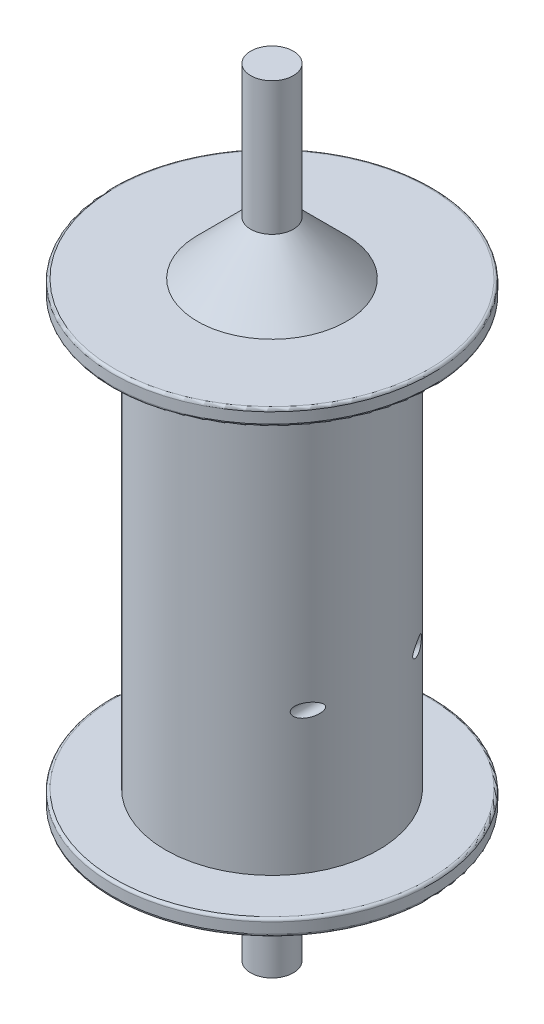
ISO-10303-21;
HEADER;
FILE_DESCRIPTION(('STEP AP214'),'2;1');
FILE_NAME('part.step','',(''),(''),'','','');
FILE_SCHEMA(('AUTOMOTIVE_DESIGN { 1 0 10303 214 1 1 1 1 }'));
ENDSEC;
DATA;
#1=APPLICATION_CONTEXT('core data for automotive mechanical design processes');
#2=APPLICATION_PROTOCOL_DEFINITION('international standard','automotive_design',2000,#1);
#3=PRODUCT_CONTEXT('',#1,'mechanical');
#4=PRODUCT('Part','Part','',(#3));
#5=PRODUCT_RELATED_PRODUCT_CATEGORY('part','',(#4));
#6=PRODUCT_DEFINITION_FORMATION('','',#4);
#7=PRODUCT_DEFINITION_CONTEXT('part definition',#1,'design');
#8=PRODUCT_DEFINITION('design','',#6,#7);
#9=PRODUCT_DEFINITION_SHAPE('','',#8);
#10=(LENGTH_UNIT() NAMED_UNIT(*) SI_UNIT(.MILLI.,.METRE.));
#11=(NAMED_UNIT(*) PLANE_ANGLE_UNIT() SI_UNIT($,.RADIAN.));
#12=(NAMED_UNIT(*) SI_UNIT($,.STERADIAN.) SOLID_ANGLE_UNIT());
#13=UNCERTAINTY_MEASURE_WITH_UNIT(LENGTH_MEASURE(1.E-05),#10,'distance_accuracy_value','');
#14=(GEOMETRIC_REPRESENTATION_CONTEXT(3) GLOBAL_UNCERTAINTY_ASSIGNED_CONTEXT((#13)) GLOBAL_UNIT_ASSIGNED_CONTEXT((#10,
#11,#12)) REPRESENTATION_CONTEXT('',''));
#15=CARTESIAN_POINT('',(0.,0.,0.));
#16=DIRECTION('',(0.,0.,1.));
#17=DIRECTION('',(1.,0.,0.));
#18=AXIS2_PLACEMENT_3D('',#15,#16,#17);
#19=CARTESIAN_POINT('',(0.,80.,0.));
#20=DIRECTION('',(0.,-1.,0.));
#21=DIRECTION('',(0.,0.,-1.));
#22=AXIS2_PLACEMENT_3D('',#19,#20,#21);
#23=CYLINDRICAL_SURFACE('',#22,20.);
#24=CARTESIAN_POINT('',(18.25,26.5,-8.18153408597678));
#25=CARTESIAN_POINT('',(18.2499979618495,26.5318652497159,-8.18153884534951));
#26=CARTESIAN_POINT('',(18.2487663345979,26.5637626117693,-8.18428763452343));
#27=CARTESIAN_POINT('',(18.2439821946172,26.6265129694464,-8.19494631892766));
#28=CARTESIAN_POINT('',(18.2404252330995,26.6573638436964,-8.20286610718577));
#29=CARTESIAN_POINT('',(18.2301689327124,26.7250311230748,-8.2256386310512));
#30=CARTESIAN_POINT('',(18.2228950490591,26.761328671932,-8.24175415086842));
#31=CARTESIAN_POINT('',(18.2060082732849,26.8306414942487,-8.27899046747495));
#32=CARTESIAN_POINT('',(18.1963903821279,26.8636495373818,-8.30012195922484));
#33=CARTESIAN_POINT('',(18.1682381813938,26.9481769531364,-8.3616327428717));
#34=CARTESIAN_POINT('',(18.1481258279905,26.9967837974186,-8.40524322231704));
#35=CARTESIAN_POINT('',(18.1048709718405,27.086731508888,-8.49801750474048));
#36=CARTESIAN_POINT('',(18.0817200906233,27.1280515165637,-8.54719660925664));
#37=CARTESIAN_POINT('',(18.0323065180823,27.2064500817202,-8.65097444042177));
#38=CARTESIAN_POINT('',(18.0059550599804,27.2432846558518,-8.70571281472922));
#39=CARTESIAN_POINT('',(17.9514818227984,27.311849051186,-8.81749273796982));
#40=CARTESIAN_POINT('',(17.9233582529772,27.3435735897036,-8.87453659505914));
#41=CARTESIAN_POINT('',(17.8656053143084,27.4027394853473,-8.99023563414717));
#42=CARTESIAN_POINT('',(17.8359727815016,27.4301713064965,-9.04889407248482));
#43=CARTESIAN_POINT('',(17.7754430835534,27.4811996440365,-9.16722681236843));
#44=CARTESIAN_POINT('',(17.7445455149505,27.5047949247112,-9.22690143440823));
#45=CARTESIAN_POINT('',(17.6564623886966,27.5659841469318,-9.3949016797859));
#46=CARTESIAN_POINT('',(17.5980046919071,27.5996926569812,-9.50398910329019));
#47=CARTESIAN_POINT('',(17.4778841662439,27.656955997879,-9.72312770751564));
#48=CARTESIAN_POINT('',(17.4162187918451,27.6805026224225,-9.83317959419977));
#49=CARTESIAN_POINT('',(17.2900944470269,27.7176469997297,-10.0532937324051));
#50=CARTESIAN_POINT('',(17.2256367929209,27.7312493874081,-10.1633559551539));
#51=CARTESIAN_POINT('',(17.0942906203097,27.7481953996157,-10.3827527365292));
#52=CARTESIAN_POINT('',(17.0274037188896,27.75154572646,-10.49208772391));
#53=CARTESIAN_POINT('',(16.9148238941733,27.7478949587043,-10.6722002204739));
#54=CARTESIAN_POINT('',(16.8696901242737,27.7440369647178,-10.7433995313137));
#55=CARTESIAN_POINT('',(16.7787484162455,27.7311205130553,-10.8848825037342));
#56=CARTESIAN_POINT('',(16.7329406414454,27.722063295701,-10.9551663796119));
#57=CARTESIAN_POINT('',(16.6409748576567,27.6982710209263,-11.0943634179851));
#58=CARTESIAN_POINT('',(16.5948176404067,27.6835463556494,-11.1632788479276));
#59=CARTESIAN_POINT('',(16.5024468260574,27.6477769933641,-11.2993809420132));
#60=CARTESIAN_POINT('',(16.4562332660875,27.6267352975636,-11.3665684106866));
#61=CARTESIAN_POINT('',(16.3537847265129,27.5719203043626,-11.5136205429476));
#62=CARTESIAN_POINT('',(16.2976547525129,27.5363416181116,-11.5929032189268));
#63=CARTESIAN_POINT('',(16.1875409778504,27.452469090144,-11.7461639963895));
#64=CARTESIAN_POINT('',(16.1335548817263,27.4041892945189,-11.8201478435371));
#65=CARTESIAN_POINT('',(16.0458100888785,27.3092310899585,-11.9388319043949));
#66=CARTESIAN_POINT('',(16.0108289717262,27.2663882303611,-11.9856747355146));
#67=CARTESIAN_POINT('',(15.9447173915627,27.1724339808456,-12.0734827039819));
#68=CARTESIAN_POINT('',(15.9135807359863,27.1213362025794,-12.1144573112112));
#69=CARTESIAN_POINT('',(15.8647445696281,27.0251510065859,-12.1783025494351));
#70=CARTESIAN_POINT('',(15.8456693582015,26.9820493263756,-12.2030949754339));
#71=CARTESIAN_POINT('',(15.8118732042328,26.8913882368862,-12.2468538774847));
#72=CARTESIAN_POINT('',(15.7971465724964,26.8438347601409,-12.2658279668584));
#73=CARTESIAN_POINT('',(15.7750311378532,26.7526030285834,-12.2942535091383));
#74=CARTESIAN_POINT('',(15.7668685552708,26.7094295324647,-12.3047122850693));
#75=CARTESIAN_POINT('',(15.7551255568537,26.6214584014552,-12.3197448098078));
#76=CARTESIAN_POINT('',(15.7515425070371,26.5766617154266,-12.3243219415329));
#77=CARTESIAN_POINT('',(15.7492592619295,26.4866487019658,-12.3272396300037));
#78=CARTESIAN_POINT('',(15.7505686938109,26.4414317219873,-12.325567890541));
#79=CARTESIAN_POINT('',(15.7579760619954,26.3520476548203,-12.3160961650278));
#80=CARTESIAN_POINT('',(15.7640755393859,26.3078809102333,-12.3082942067193));
#81=CARTESIAN_POINT('',(15.7803907811538,26.2226991021763,-12.2873689233822));
#82=CARTESIAN_POINT('',(15.7905148796342,26.1816365948824,-12.2743640615191));
#83=CARTESIAN_POINT('',(15.814221068499,26.1023256097946,-12.2438060506497));
#84=CARTESIAN_POINT('',(15.8278045029705,26.0640782332516,-12.2262511337222));
#85=CARTESIAN_POINT('',(15.8656838826613,25.9713272201487,-12.1770878179632));
#86=CARTESIAN_POINT('',(15.8918463926548,25.9189215891329,-12.142956664645));
#87=CARTESIAN_POINT('',(15.9486035008762,25.8215771563617,-12.0683165498785));
#88=CARTESIAN_POINT('',(15.9792096104827,25.7766584196726,-12.0277909989893));
#89=CARTESIAN_POINT('',(16.0605929323507,25.6714288143793,-11.9190636294709));
#90=CARTESIAN_POINT('',(16.1133386769171,25.6159022397819,-11.847732779761));
#91=CARTESIAN_POINT('',(16.222052111135,25.5188695717282,-11.6984453137725));
#92=CARTESIAN_POINT('',(16.2780254413307,25.4773889510443,-11.6204769771463));
#93=CARTESIAN_POINT('',(16.3817913420178,25.4121521582266,-11.4736050995131));
#94=CARTESIAN_POINT('',(16.4293973576002,25.3865959495468,-11.4053487899968));
#95=CARTESIAN_POINT('',(16.5248107730467,25.3426510104751,-11.2666640559575));
#96=CARTESIAN_POINT('',(16.5726182843945,25.3242669858039,-11.196234237966));
#97=CARTESIAN_POINT('',(16.6680585368355,25.2938370631572,-11.0536512567992));
#98=CARTESIAN_POINT('',(16.71569049416,25.2818078624627,-10.9814940692459));
#99=CARTESIAN_POINT('',(16.8103432993606,25.2635320725748,-10.836046078069));
#100=CARTESIAN_POINT('',(16.8573639654045,25.2572871668308,-10.7627549507318));
#101=CARTESIAN_POINT('',(16.9730176819289,25.2483710624827,-10.5798557519244));
#102=CARTESIAN_POINT('',(17.0411461216582,25.2488723222167,-10.4697669449177));
#103=CARTESIAN_POINT('',(17.1750362359315,25.2604921786806,-10.2486515491821));
#104=CARTESIAN_POINT('',(17.2407962643157,25.2716180176591,-10.1376243719829));
#105=CARTESIAN_POINT('',(17.3693347642527,25.3039768665793,-9.91577509869834));
#106=CARTESIAN_POINT('',(17.4321216139703,25.3251793552162,-9.80495339114142));
#107=CARTESIAN_POINT('',(17.5545319110459,25.377754078299,-9.5840660570318));
#108=CARTESIAN_POINT('',(17.6141579876834,25.4091177007132,-9.47399987052744));
#109=CARTESIAN_POINT('',(17.7124503527016,25.4717927065877,-9.28851883401322));
#110=CARTESIAN_POINT('',(17.7520305525731,25.5002873223724,-9.21263080203235));
#111=CARTESIAN_POINT('',(17.8292944910218,25.5633730533634,-9.06219636824689));
#112=CARTESIAN_POINT('',(17.8669748377823,25.5979746080458,-8.98765250865495));
#113=CARTESIAN_POINT('',(17.9246598456303,25.6583107239406,-8.87180022234154));
#114=CARTESIAN_POINT('',(17.9454554414222,25.6816859033931,-8.82965309800986));
#115=CARTESIAN_POINT('',(17.9861133324433,25.731165057513,-8.74653435697943));
#116=CARTESIAN_POINT('',(18.0059759661335,25.7572680313311,-8.70556231611631));
#117=CARTESIAN_POINT('',(18.0445251983253,25.8125414279372,-8.62537435256812));
#118=CARTESIAN_POINT('',(18.0632154514802,25.8417014747505,-8.58615309503916));
#119=CARTESIAN_POINT('',(18.099184385422,25.9036962173159,-8.51006982284513));
#120=CARTESIAN_POINT('',(18.1164647540978,25.9365264041724,-8.47320499890406));
#121=CARTESIAN_POINT('',(18.1460255840916,25.999898175494,-8.40968126030712));
#122=CARTESIAN_POINT('',(18.1586301207258,26.0296759991292,-8.38241909712536));
#123=CARTESIAN_POINT('',(18.18222598905,26.0926038385701,-8.33111366009879));
#124=CARTESIAN_POINT('',(18.1932151904269,26.1257582116088,-8.30707464055781));
#125=CARTESIAN_POINT('',(18.2131045786201,26.1962848840155,-8.26337740487946));
#126=CARTESIAN_POINT('',(18.221968351751,26.2337164103737,-8.24379580742511));
#127=CARTESIAN_POINT('',(18.2364214595161,26.312059220127,-8.21177505077274));
#128=CARTESIAN_POINT('',(18.2420279580057,26.3529509382651,-8.1992984595468));
#129=CARTESIAN_POINT('',(18.2470293131828,26.4121199779719,-8.18815804078524));
#130=CARTESIAN_POINT('',(18.2481385271482,26.4295784500674,-8.18568528219678));
#131=CARTESIAN_POINT('',(18.2496245533631,26.4646879532103,-8.18237172295775));
#132=CARTESIAN_POINT('',(18.250001129622,26.4823390444621,-8.18153144814808));
#133=CARTESIAN_POINT('',(18.25,26.5,-8.18153408597678));
#134=B_SPLINE_CURVE_WITH_KNOTS('',3,(#24,#25,#26,#27,#28,#29,#30,#31,#32,#33,#34,#35,#36,#37,
#38,#39,#40,#41,#42,#43,#44,#45,#46,#47,#48,#49,#50,#51,#52,#53,#54,#55,#56,#57,#58,#59,#60,#61,
#62,#63,#64,#65,#66,#67,#68,#69,#70,#71,#72,#73,#74,#75,#76,#77,#78,#79,#80,#81,#82,#83,#84,#85,
#86,#87,#88,#89,#90,#91,#92,#93,#94,#95,#96,#97,#98,#99,#100,#101,#102,#103,#104,#105,#106,#107,
#108,#109,#110,#111,#112,#113,#114,#115,#116,#117,#118,#119,#120,#121,#122,#123,#124,#125,#126,
#127,#128,#129,#130,#131,#132,#133),.UNSPECIFIED.,.T.,.F.,(4,2,2,2,2,2,2,2,2,2,2,2,2,2,2,2,2,2,
2,2,2,2,2,2,2,2,2,2,2,2,2,2,2,2,2,2,2,2,2,2,2,2,2,2,2,2,2,2,2,2,2,2,2,2,4),(0.,
0.0955188878894089,0.19122105775398,0.311656689349104,0.432351455411104,0.636192488468969,
0.840607891350387,1.05342106226923,1.2664528437971,1.479951341028,1.69351846861236,
2.07778977112906,2.46237081668899,2.84677249818878,3.230922822209,3.48394236641333,
3.73690157559069,3.9893991377883,4.24177692825649,4.5514105911752,4.86070326086815,
5.07753895246557,5.29402068307205,5.45323615260761,5.61224239007829,5.74715321293668,
5.8819864049894,6.01708505442484,6.15222718657008,6.28445307743014,6.41673042180654,
6.61895177951463,6.82170667231587,7.13393538059804,7.44672733010158,7.70753094081837,
7.96850538000418,8.23016216049214,8.49189506912547,8.8797584124484,9.26788633183452,
9.6548460655668,10.0414786872295,10.3119215721782,10.5828313229606,10.7402303123511,
10.8975717522274,11.0543954646152,11.2110285880269,11.3376958565531,11.4645287040275,
11.5934000314521,11.7215859778386,11.7745092006407,11.8274494677681),.UNSPECIFIED.);
#135=CARTESIAN_POINT('',(18.25,26.5,-8.18153408597678));
#136=VERTEX_POINT('',#135);
#137=EDGE_CURVE('E87',#136,#136,#134,.T.);
#138=ORIENTED_EDGE('',*,*,#137,.T.);
#139=EDGE_LOOP('',(#138));
#140=FACE_BOUND('',#139,.T.);
#141=CARTESIAN_POINT('',(18.25,26.5,8.18153408597678));
#142=CARTESIAN_POINT('',(18.2499979618495,26.4681347502841,8.18153884534951));
#143=CARTESIAN_POINT('',(18.2487663345979,26.4362373882307,8.18428763452343));
#144=CARTESIAN_POINT('',(18.2439821946172,26.3734870305536,8.19494631892766));
#145=CARTESIAN_POINT('',(18.2404252330995,26.3426361563036,8.20286610718577));
#146=CARTESIAN_POINT('',(18.2301689327124,26.2749688769252,8.2256386310512));
#147=CARTESIAN_POINT('',(18.2228950490591,26.2386713280679,8.24175415086842));
#148=CARTESIAN_POINT('',(18.2060082732849,26.1693585057513,8.27899046747496));
#149=CARTESIAN_POINT('',(18.1963903821279,26.1363504626182,8.30012195922484));
#150=CARTESIAN_POINT('',(18.1682381813938,26.0518230468636,8.3616327428717));
#151=CARTESIAN_POINT('',(18.1481258279905,26.0032162025813,8.40524322231704));
#152=CARTESIAN_POINT('',(18.1048709718405,25.913268491112,8.49801750474048));
#153=CARTESIAN_POINT('',(18.0817200906233,25.8719484834363,8.54719660925664));
#154=CARTESIAN_POINT('',(18.0323065180823,25.7935499182798,8.65097444042177));
#155=CARTESIAN_POINT('',(18.0059550599804,25.7567153441482,8.70571281472922));
#156=CARTESIAN_POINT('',(17.9514818227984,25.688150948814,8.81749273796982));
#157=CARTESIAN_POINT('',(17.9233582529772,25.6564264102964,8.87453659505914));
#158=CARTESIAN_POINT('',(17.8656053143084,25.5972605146527,8.99023563414717));
#159=CARTESIAN_POINT('',(17.8359727815016,25.5698286935035,9.04889407248482));
#160=CARTESIAN_POINT('',(17.7754430835534,25.5188003559635,9.16722681236843));
#161=CARTESIAN_POINT('',(17.7445455149505,25.4952050752888,9.22690143440823));
#162=CARTESIAN_POINT('',(17.6564623886966,25.4340158530682,9.3949016797859));
#163=CARTESIAN_POINT('',(17.5980046919071,25.4003073430188,9.50398910329019));
#164=CARTESIAN_POINT('',(17.4778841662439,25.343044002121,9.72312770751564));
#165=CARTESIAN_POINT('',(17.4162187918451,25.3194973775775,9.83317959419977));
#166=CARTESIAN_POINT('',(17.2900944470269,25.2823530002703,10.0532937324051));
#167=CARTESIAN_POINT('',(17.2256367929209,25.2687506125919,10.1633559551539));
#168=CARTESIAN_POINT('',(17.0942906203097,25.2518046003843,10.3827527365292));
#169=CARTESIAN_POINT('',(17.0274037188896,25.24845427354,10.49208772391));
#170=CARTESIAN_POINT('',(16.9148238941733,25.2521050412957,10.6722002204739));
#171=CARTESIAN_POINT('',(16.8696901242737,25.2559630352822,10.7433995313137));
#172=CARTESIAN_POINT('',(16.7787484162455,25.2688794869447,10.8848825037342));
#173=CARTESIAN_POINT('',(16.7329406414454,25.277936704299,10.9551663796119));
#174=CARTESIAN_POINT('',(16.6409748576567,25.3017289790737,11.0943634179851));
#175=CARTESIAN_POINT('',(16.5948176404067,25.3164536443506,11.1632788479276));
#176=CARTESIAN_POINT('',(16.5024468260574,25.3522230066359,11.2993809420132));
#177=CARTESIAN_POINT('',(16.4562332660875,25.3732647024364,11.3665684106866));
#178=CARTESIAN_POINT('',(16.3537847265129,25.4280796956374,11.5136205429476));
#179=CARTESIAN_POINT('',(16.2976547525129,25.4636583818884,11.5929032189268));
#180=CARTESIAN_POINT('',(16.1875409778504,25.547530909856,11.7461639963895));
#181=CARTESIAN_POINT('',(16.1335548817263,25.5958107054811,11.8201478435371));
#182=CARTESIAN_POINT('',(16.0458100888785,25.6907689100415,11.9388319043949));
#183=CARTESIAN_POINT('',(16.0108289717262,25.7336117696389,11.9856747355146));
#184=CARTESIAN_POINT('',(15.9447173915627,25.8275660191544,12.0734827039819));
#185=CARTESIAN_POINT('',(15.9135807359863,25.8786637974206,12.1144573112112));
#186=CARTESIAN_POINT('',(15.8647445696281,25.9748489934141,12.1783025494351));
#187=CARTESIAN_POINT('',(15.8456693582015,26.0179506736244,12.2030949754339));
#188=CARTESIAN_POINT('',(15.8118732042328,26.1086117631138,12.2468538774847));
#189=CARTESIAN_POINT('',(15.7971465724964,26.1561652398591,12.2658279668584));
#190=CARTESIAN_POINT('',(15.7750311378532,26.2473969714166,12.2942535091383));
#191=CARTESIAN_POINT('',(15.7668685552708,26.2905704675353,12.3047122850693));
#192=CARTESIAN_POINT('',(15.7551255568537,26.3785415985448,12.3197448098078));
#193=CARTESIAN_POINT('',(15.7515425070371,26.4233382845734,12.3243219415329));
#194=CARTESIAN_POINT('',(15.7492592619295,26.5133512980342,12.3272396300037));
#195=CARTESIAN_POINT('',(15.7505686938109,26.5585682780127,12.325567890541));
#196=CARTESIAN_POINT('',(15.7579760619954,26.6479523451797,12.3160961650278));
#197=CARTESIAN_POINT('',(15.7640755393859,26.6921190897667,12.3082942067193));
#198=CARTESIAN_POINT('',(15.7803907811538,26.7773008978237,12.2873689233822));
#199=CARTESIAN_POINT('',(15.7905148796342,26.8183634051176,12.2743640615191));
#200=CARTESIAN_POINT('',(15.814221068499,26.8976743902054,12.2438060506497));
#201=CARTESIAN_POINT('',(15.8278045029705,26.9359217667484,12.2262511337222));
#202=CARTESIAN_POINT('',(15.8656838826613,27.0286727798513,12.1770878179632));
#203=CARTESIAN_POINT('',(15.8918463926548,27.0810784108671,12.142956664645));
#204=CARTESIAN_POINT('',(15.9486035008762,27.1784228436383,12.0683165498785));
#205=CARTESIAN_POINT('',(15.9792096104827,27.2233415803274,12.0277909989893));
#206=CARTESIAN_POINT('',(16.0605929323507,27.3285711856207,11.9190636294709));
#207=CARTESIAN_POINT('',(16.1133386769171,27.3840977602181,11.847732779761));
#208=CARTESIAN_POINT('',(16.222052111135,27.4811304282718,11.6984453137725));
#209=CARTESIAN_POINT('',(16.2780254413307,27.5226110489557,11.6204769771463));
#210=CARTESIAN_POINT('',(16.3817913420178,27.5878478417734,11.4736050995131));
#211=CARTESIAN_POINT('',(16.4293973576002,27.6134040504532,11.4053487899968));
#212=CARTESIAN_POINT('',(16.5248107730467,27.6573489895249,11.2666640559575));
#213=CARTESIAN_POINT('',(16.5726182843945,27.6757330141961,11.196234237966));
#214=CARTESIAN_POINT('',(16.6680585368355,27.7061629368428,11.0536512567992));
#215=CARTESIAN_POINT('',(16.71569049416,27.7181921375373,10.9814940692459));
#216=CARTESIAN_POINT('',(16.8103432993606,27.7364679274252,10.836046078069));
#217=CARTESIAN_POINT('',(16.8573639654045,27.7427128331692,10.7627549507318));
#218=CARTESIAN_POINT('',(16.9730176819289,27.7516289375173,10.5798557519244));
#219=CARTESIAN_POINT('',(17.0411461216582,27.7511276777833,10.4697669449177));
#220=CARTESIAN_POINT('',(17.1750362359315,27.7395078213194,10.2486515491821));
#221=CARTESIAN_POINT('',(17.2407962643157,27.7283819823409,10.1376243719829));
#222=CARTESIAN_POINT('',(17.3693347642527,27.6960231334207,9.91577509869834));
#223=CARTESIAN_POINT('',(17.4321216139703,27.6748206447838,9.80495339114142));
#224=CARTESIAN_POINT('',(17.5545319110459,27.622245921701,9.5840660570318));
#225=CARTESIAN_POINT('',(17.6141579876834,27.5908822992868,9.47399987052744));
#226=CARTESIAN_POINT('',(17.7124503527016,27.5282072934123,9.28851883401322));
#227=CARTESIAN_POINT('',(17.7520305525731,27.4997126776276,9.21263080203235));
#228=CARTESIAN_POINT('',(17.8292944910218,27.4366269466366,9.06219636824689));
#229=CARTESIAN_POINT('',(17.8669748377823,27.4020253919542,8.98765250865495));
#230=CARTESIAN_POINT('',(17.9246598456303,27.3416892760594,8.87180022234154));
#231=CARTESIAN_POINT('',(17.9454554414222,27.3183140966069,8.82965309800986));
#232=CARTESIAN_POINT('',(17.9861133324433,27.268834942487,8.74653435697943));
#233=CARTESIAN_POINT('',(18.0059759661335,27.2427319686689,8.70556231611631));
#234=CARTESIAN_POINT('',(18.0445251983253,27.1874585720628,8.62537435256812));
#235=CARTESIAN_POINT('',(18.0632154514802,27.1582985252495,8.58615309503916));
#236=CARTESIAN_POINT('',(18.099184385422,27.0963037826842,8.51006982284513));
#237=CARTESIAN_POINT('',(18.1164647540978,27.0634735958276,8.47320499890406));
#238=CARTESIAN_POINT('',(18.1460255840916,27.000101824506,8.40968126030712));
#239=CARTESIAN_POINT('',(18.1586301207258,26.9703240008708,8.38241909712536));
#240=CARTESIAN_POINT('',(18.18222598905,26.9073961614299,8.33111366009879));
#241=CARTESIAN_POINT('',(18.1932151904269,26.8742417883912,8.30707464055781));
#242=CARTESIAN_POINT('',(18.2131045786201,26.8037151159845,8.26337740487946));
#243=CARTESIAN_POINT('',(18.221968351751,26.7662835896263,8.24379580742511));
#244=CARTESIAN_POINT('',(18.2364214595161,26.687940779873,8.21177505077274));
#245=CARTESIAN_POINT('',(18.2420279580057,26.6470490617349,8.1992984595468));
#246=CARTESIAN_POINT('',(18.2470293131828,26.5878800220281,8.18815804078524));
#247=CARTESIAN_POINT('',(18.2481385271482,26.5704215499326,8.18568528219678));
#248=CARTESIAN_POINT('',(18.2496245533631,26.5353120467897,8.18237172295775));
#249=CARTESIAN_POINT('',(18.250001129622,26.5176609555379,8.18153144814808));
#250=CARTESIAN_POINT('',(18.25,26.5,8.18153408597678));
#251=B_SPLINE_CURVE_WITH_KNOTS('',3,(#141,#142,#143,#144,#145,#146,#147,#148,#149,#150,#151,
#152,#153,#154,#155,#156,#157,#158,#159,#160,#161,#162,#163,#164,#165,#166,#167,#168,#169,#170,
#171,#172,#173,#174,#175,#176,#177,#178,#179,#180,#181,#182,#183,#184,#185,#186,#187,#188,#189,
#190,#191,#192,#193,#194,#195,#196,#197,#198,#199,#200,#201,#202,#203,#204,#205,#206,#207,#208,
#209,#210,#211,#212,#213,#214,#215,#216,#217,#218,#219,#220,#221,#222,#223,#224,#225,#226,#227,
#228,#229,#230,#231,#232,#233,#234,#235,#236,#237,#238,#239,#240,#241,#242,#243,#244,#245,#246,
#247,#248,#249,#250),.UNSPECIFIED.,.T.,.F.,(4,2,2,2,2,2,2,2,2,2,2,2,2,2,2,2,2,2,2,2,2,2,2,2,2,2,
2,2,2,2,2,2,2,2,2,2,2,2,2,2,2,2,2,2,2,2,2,2,2,2,2,2,2,2,4),(0.,0.0955188878894089,
0.19122105775398,0.311656689349112,0.432351455411104,0.636192488468969,0.840607891350387,
1.05342106226923,1.2664528437971,1.479951341028,1.69351846861236,2.07778977112906,
2.46237081668899,2.84677249818878,3.230922822209,3.48394236641333,3.73690157559069,
3.9893991377883,4.2417769282565,4.5514105911752,4.86070326086815,5.07753895246557,
5.29402068307205,5.45323615260761,5.61224239007829,5.74715321293668,5.8819864049894,
6.01708505442484,6.15222718657008,6.28445307743014,6.41673042180654,6.61895177951463,
6.82170667231588,7.13393538059804,7.44672733010158,7.70753094081837,7.96850538000418,
8.23016216049215,8.49189506912547,8.8797584124484,9.26788633183452,9.6548460655668,
10.0414786872295,10.3119215721782,10.5828313229606,10.7402303123511,10.8975717522274,
11.0543954646152,11.2110285880269,11.3376958565531,11.4645287040275,11.5934000314521,
11.7215859778386,11.7745092006407,11.8274494677681),.UNSPECIFIED.);
#252=CARTESIAN_POINT('',(18.25,26.5,8.18153408597678));
#253=VERTEX_POINT('',#252);
#254=EDGE_CURVE('E96',#253,#253,#251,.T.);
#255=ORIENTED_EDGE('',*,*,#254,.T.);
#256=EDGE_LOOP('',(#255));
#257=FACE_BOUND('',#256,.T.);
#258=CARTESIAN_POINT('',(0.,80.,0.));
#259=DIRECTION('',(0.,1.,0.));
#260=DIRECTION('',(0.,0.,1.));
#261=AXIS2_PLACEMENT_3D('',#258,#259,#260);
#262=CIRCLE('',#261,20.);
#263=CARTESIAN_POINT('',(0.,80.,20.));
#264=VERTEX_POINT('',#263);
#265=EDGE_CURVE('E86',#264,#264,#262,.T.);
#266=ORIENTED_EDGE('',*,*,#265,.F.);
#267=EDGE_LOOP('',(#266));
#268=FACE_BOUND('',#267,.T.);
#269=CARTESIAN_POINT('',(0.,0.,0.));
#270=DIRECTION('',(0.,1.,0.));
#271=DIRECTION('',(0.,0.,1.));
#272=AXIS2_PLACEMENT_3D('',#269,#270,#271);
#273=CIRCLE('',#272,20.);
#274=CARTESIAN_POINT('',(0.,0.,20.));
#275=VERTEX_POINT('',#274);
#276=EDGE_CURVE('E95',#275,#275,#273,.T.);
#277=ORIENTED_EDGE('',*,*,#276,.T.);
#278=EDGE_LOOP('',(#277));
#279=FACE_BOUND('',#278,.T.);
#280=ADVANCED_FACE('F41',(#140,#257,#268,#279),#23,.T.);
#281=CARTESIAN_POINT('',(0.,83.,0.));
#282=DIRECTION('',(0.,-1.,0.));
#283=DIRECTION('',(0.,0.,-1.));
#284=AXIS2_PLACEMENT_3D('',#281,#282,#283);
#285=CYLINDRICAL_SURFACE('',#284,30.);
#286=CARTESIAN_POINT('',(0.,80.5,0.));
#287=DIRECTION('',(0.,1.,0.));
#288=DIRECTION('',(0.,0.,1.));
#289=AXIS2_PLACEMENT_3D('',#286,#287,#288);
#290=CIRCLE('',#289,30.);
#291=CARTESIAN_POINT('',(0.,80.5,30.));
#292=VERTEX_POINT('',#291);
#293=EDGE_CURVE('E68',#292,#292,#290,.T.);
#294=ORIENTED_EDGE('',*,*,#293,.T.);
#295=EDGE_LOOP('',(#294));
#296=FACE_BOUND('',#295,.T.);
#297=CARTESIAN_POINT('',(0.,82.5,0.));
#298=DIRECTION('',(0.,1.,0.));
#299=DIRECTION('',(0.,0.,1.));
#300=AXIS2_PLACEMENT_3D('',#297,#298,#299);
#301=CIRCLE('',#300,30.);
#302=CARTESIAN_POINT('',(0.,82.5,30.));
#303=VERTEX_POINT('',#302);
#304=EDGE_CURVE('E71',#303,#303,#301,.F.);
#305=ORIENTED_EDGE('',*,*,#304,.T.);
#306=EDGE_LOOP('',(#305));
#307=FACE_BOUND('',#306,.T.);
#308=ADVANCED_FACE('F129',(#296,#307),#285,.T.);
#309=CARTESIAN_POINT('',(0.,83.,0.));
#310=DIRECTION('',(0.,1.,0.));
#311=DIRECTION('',(0.,0.,1.));
#312=AXIS2_PLACEMENT_3D('',#309,#310,#311);
#313=PLANE('',#312);
#314=CARTESIAN_POINT('',(0.,83.,0.));
#315=DIRECTION('',(0.,1.,0.));
#316=DIRECTION('',(0.,0.,1.));
#317=AXIS2_PLACEMENT_3D('',#314,#315,#316);
#318=CIRCLE('',#317,14.);
#319=CARTESIAN_POINT('',(0.,83.,-14.));
#320=VERTEX_POINT('',#319);
#321=EDGE_CURVE('E53',#320,#320,#318,.F.);
#322=ORIENTED_EDGE('',*,*,#321,.T.);
#323=EDGE_LOOP('',(#322));
#324=FACE_BOUND('',#323,.T.);
#325=CARTESIAN_POINT('',(0.,83.,0.));
#326=DIRECTION('',(0.,1.,0.));
#327=DIRECTION('',(0.,0.,1.));
#328=AXIS2_PLACEMENT_3D('',#325,#326,#327);
#329=CIRCLE('',#328,29.5);
#330=CARTESIAN_POINT('',(0.,83.,29.5));
#331=VERTEX_POINT('',#330);
#332=EDGE_CURVE('E62',#331,#331,#329,.T.);
#333=ORIENTED_EDGE('',*,*,#332,.T.);
#334=EDGE_LOOP('',(#333));
#335=FACE_BOUND('',#334,.T.);
#336=ADVANCED_FACE('F126',(#324,#335),#313,.T.);
#337=CARTESIAN_POINT('',(0.,80.,0.));
#338=DIRECTION('',(0.,1.,0.));
#339=DIRECTION('',(0.,0.,1.));
#340=AXIS2_PLACEMENT_3D('',#337,#338,#339);
#341=PLANE('',#340);
#342=CARTESIAN_POINT('',(0.,80.,0.));
#343=DIRECTION('',(0.,1.,0.));
#344=DIRECTION('',(0.,0.,1.));
#345=AXIS2_PLACEMENT_3D('',#342,#343,#344);
#346=CIRCLE('',#345,29.5);
#347=CARTESIAN_POINT('',(0.,80.,29.5));
#348=VERTEX_POINT('',#347);
#349=EDGE_CURVE('E65',#348,#348,#346,.F.);
#350=ORIENTED_EDGE('',*,*,#349,.T.);
#351=EDGE_LOOP('',(#350));
#352=FACE_BOUND('',#351,.T.);
#353=ORIENTED_EDGE('',*,*,#265,.T.);
#354=EDGE_LOOP('',(#353));
#355=FACE_BOUND('',#354,.T.);
#356=ADVANCED_FACE('F124',(#352,#355),#341,.F.);
#357=CARTESIAN_POINT('',(0.,-3.,0.));
#358=DIRECTION('',(0.,1.,0.));
#359=DIRECTION('',(0.,0.,1.));
#360=AXIS2_PLACEMENT_3D('',#357,#358,#359);
#361=CYLINDRICAL_SURFACE('',#360,30.);
#362=CARTESIAN_POINT('',(0.,-0.5,0.));
#363=DIRECTION('',(0.,-1.,0.));
#364=DIRECTION('',(0.,0.,-1.));
#365=AXIS2_PLACEMENT_3D('',#362,#363,#364);
#366=CIRCLE('',#365,30.);
#367=CARTESIAN_POINT('',(0.,-0.5,-30.));
#368=VERTEX_POINT('',#367);
#369=EDGE_CURVE('E80',#368,#368,#366,.T.);
#370=ORIENTED_EDGE('',*,*,#369,.T.);
#371=EDGE_LOOP('',(#370));
#372=FACE_BOUND('',#371,.T.);
#373=CARTESIAN_POINT('',(0.,-2.5,0.));
#374=DIRECTION('',(0.,-1.,0.));
#375=DIRECTION('',(0.,0.,-1.));
#376=AXIS2_PLACEMENT_3D('',#373,#374,#375);
#377=CIRCLE('',#376,30.);
#378=CARTESIAN_POINT('',(0.,-2.5,-30.));
#379=VERTEX_POINT('',#378);
#380=EDGE_CURVE('E83',#379,#379,#377,.F.);
#381=ORIENTED_EDGE('',*,*,#380,.T.);
#382=EDGE_LOOP('',(#381));
#383=FACE_BOUND('',#382,.T.);
#384=ADVANCED_FACE('F118',(#372,#383),#361,.T.);
#385=CARTESIAN_POINT('',(0.,-3.,0.));
#386=DIRECTION('',(0.,-1.,0.));
#387=DIRECTION('',(0.,0.,-1.));
#388=AXIS2_PLACEMENT_3D('',#385,#386,#387);
#389=PLANE('',#388);
#390=CARTESIAN_POINT('',(0.,-3.,0.));
#391=DIRECTION('',(0.,-1.,0.));
#392=DIRECTION('',(0.,0.,-1.));
#393=AXIS2_PLACEMENT_3D('',#390,#391,#392);
#394=CIRCLE('',#393,13.9999999999999);
#395=CARTESIAN_POINT('',(0.,-3.,13.9999999999999));
#396=VERTEX_POINT('',#395);
#397=EDGE_CURVE('E10',#396,#396,#394,.F.);
#398=ORIENTED_EDGE('',*,*,#397,.T.);
#399=EDGE_LOOP('',(#398));
#400=FACE_BOUND('',#399,.T.);
#401=CARTESIAN_POINT('',(0.,-3.,0.));
#402=DIRECTION('',(0.,-1.,0.));
#403=DIRECTION('',(0.,0.,-1.));
#404=AXIS2_PLACEMENT_3D('',#401,#402,#403);
#405=CIRCLE('',#404,29.5);
#406=CARTESIAN_POINT('',(0.,-3.,-29.5));
#407=VERTEX_POINT('',#406);
#408=EDGE_CURVE('E74',#407,#407,#405,.T.);
#409=ORIENTED_EDGE('',*,*,#408,.T.);
#410=EDGE_LOOP('',(#409));
#411=FACE_BOUND('',#410,.T.);
#412=ADVANCED_FACE('F114',(#400,#411),#389,.T.);
#413=CARTESIAN_POINT('',(0.,0.,0.));
#414=DIRECTION('',(0.,-1.,0.));
#415=DIRECTION('',(0.,0.,-1.));
#416=AXIS2_PLACEMENT_3D('',#413,#414,#415);
#417=PLANE('',#416);
#418=CARTESIAN_POINT('',(0.,0.,0.));
#419=DIRECTION('',(0.,-1.,0.));
#420=DIRECTION('',(0.,0.,-1.));
#421=AXIS2_PLACEMENT_3D('',#418,#419,#420);
#422=CIRCLE('',#421,29.5);
#423=CARTESIAN_POINT('',(0.,0.,-29.5));
#424=VERTEX_POINT('',#423);
#425=EDGE_CURVE('E77',#424,#424,#422,.F.);
#426=ORIENTED_EDGE('',*,*,#425,.T.);
#427=EDGE_LOOP('',(#426));
#428=FACE_BOUND('',#427,.T.);
#429=ORIENTED_EDGE('',*,*,#276,.F.);
#430=EDGE_LOOP('',(#429));
#431=FACE_BOUND('',#430,.T.);
#432=ADVANCED_FACE('F110',(#428,#431),#417,.F.);
#433=CARTESIAN_POINT('',(17.,26.5,-30.));
#434=DIRECTION('',(0.,0.,1.));
#435=DIRECTION('',(1.,0.,0.));
#436=AXIS2_PLACEMENT_3D('',#433,#434,#435);
#437=CYLINDRICAL_SURFACE('',#436,1.25);
#438=ORIENTED_EDGE('',*,*,#254,.F.);
#439=EDGE_LOOP('',(#438));
#440=FACE_BOUND('',#439,.T.);
#441=ORIENTED_EDGE('',*,*,#137,.F.);
#442=EDGE_LOOP('',(#441));
#443=FACE_BOUND('',#442,.T.);
#444=ADVANCED_FACE('F104',(#440,#443),#437,.F.);
#445=CARTESIAN_POINT('',(0.,-0.5,0.));
#446=DIRECTION('',(0.,-1.,0.));
#447=DIRECTION('',(0.,0.,-1.));
#448=AXIS2_PLACEMENT_3D('',#445,#446,#447);
#449=TOROIDAL_SURFACE('',#448,29.5,0.5);
#450=ORIENTED_EDGE('',*,*,#425,.F.);
#451=EDGE_LOOP('',(#450));
#452=FACE_BOUND('',#451,.T.);
#453=ORIENTED_EDGE('',*,*,#369,.F.);
#454=EDGE_LOOP('',(#453));
#455=FACE_BOUND('',#454,.T.);
#456=ADVANCED_FACE('F109',(#452,#455),#449,.T.);
#457=CARTESIAN_POINT('',(0.,-2.5,0.));
#458=DIRECTION('',(0.,-1.,0.));
#459=DIRECTION('',(0.,0.,-1.));
#460=AXIS2_PLACEMENT_3D('',#457,#458,#459);
#461=TOROIDAL_SURFACE('',#460,29.5,0.5);
#462=ORIENTED_EDGE('',*,*,#380,.F.);
#463=EDGE_LOOP('',(#462));
#464=FACE_BOUND('',#463,.T.);
#465=ORIENTED_EDGE('',*,*,#408,.F.);
#466=EDGE_LOOP('',(#465));
#467=FACE_BOUND('',#466,.T.);
#468=ADVANCED_FACE('F156',(#464,#467),#461,.T.);
#469=CARTESIAN_POINT('',(0.,80.5,0.));
#470=DIRECTION('',(0.,1.,0.));
#471=DIRECTION('',(0.,0.,1.));
#472=AXIS2_PLACEMENT_3D('',#469,#470,#471);
#473=TOROIDAL_SURFACE('',#472,29.5,0.5);
#474=ORIENTED_EDGE('',*,*,#349,.F.);
#475=EDGE_LOOP('',(#474));
#476=FACE_BOUND('',#475,.T.);
#477=ORIENTED_EDGE('',*,*,#293,.F.);
#478=EDGE_LOOP('',(#477));
#479=FACE_BOUND('',#478,.T.);
#480=ADVANCED_FACE('F146',(#476,#479),#473,.T.);
#481=CARTESIAN_POINT('',(0.,82.5,0.));
#482=DIRECTION('',(0.,1.,0.));
#483=DIRECTION('',(0.,0.,1.));
#484=AXIS2_PLACEMENT_3D('',#481,#482,#483);
#485=TOROIDAL_SURFACE('',#484,29.5,0.5);
#486=ORIENTED_EDGE('',*,*,#304,.F.);
#487=EDGE_LOOP('',(#486));
#488=FACE_BOUND('',#487,.T.);
#489=ORIENTED_EDGE('',*,*,#332,.F.);
#490=EDGE_LOOP('',(#489));
#491=FACE_BOUND('',#490,.T.);
#492=ADVANCED_FACE('F143',(#488,#491),#485,.T.);
#493=CARTESIAN_POINT('',(0.,118.,0.));
#494=DIRECTION('',(0.,-1.,0.));
#495=DIRECTION('',(0.,0.,-1.));
#496=AXIS2_PLACEMENT_3D('',#493,#494,#495);
#497=CYLINDRICAL_SURFACE('',#496,4.);
#498=CARTESIAN_POINT('',(0.,93.0000000000001,0.));
#499=DIRECTION('',(0.,1.,0.));
#500=DIRECTION('',(0.,0.,1.));
#501=AXIS2_PLACEMENT_3D('',#498,#499,#500);
#502=CIRCLE('',#501,4.);
#503=CARTESIAN_POINT('',(0.,93.0000000000001,-4.00000000000001));
#504=VERTEX_POINT('',#503);
#505=EDGE_CURVE('E57',#504,#504,#502,.T.);
#506=ORIENTED_EDGE('',*,*,#505,.T.);
#507=EDGE_LOOP('',(#506));
#508=FACE_BOUND('',#507,.T.);
#509=CARTESIAN_POINT('',(0.,118.,0.));
#510=DIRECTION('',(0.,1.,0.));
#511=DIRECTION('',(0.,0.,1.));
#512=AXIS2_PLACEMENT_3D('',#509,#510,#511);
#513=CIRCLE('',#512,4.);
#514=CARTESIAN_POINT('',(0.,118.,4.));
#515=VERTEX_POINT('',#514);
#516=EDGE_CURVE('E181',#515,#515,#513,.T.);
#517=ORIENTED_EDGE('',*,*,#516,.F.);
#518=EDGE_LOOP('',(#517));
#519=FACE_BOUND('',#518,.T.);
#520=ADVANCED_FACE('F112',(#508,#519),#497,.T.);
#521=CARTESIAN_POINT('',(0.,118.,0.));
#522=DIRECTION('',(0.,1.,0.));
#523=DIRECTION('',(0.,0.,1.));
#524=AXIS2_PLACEMENT_3D('',#521,#522,#523);
#525=PLANE('',#524);
#526=ORIENTED_EDGE('',*,*,#516,.T.);
#527=EDGE_LOOP('',(#526));
#528=FACE_BOUND('',#527,.T.);
#529=ADVANCED_FACE('F154',(#528),#525,.T.);
#530=CARTESIAN_POINT('',(0.,-28.,0.));
#531=DIRECTION('',(0.,1.,0.));
#532=DIRECTION('',(0.,0.,1.));
#533=AXIS2_PLACEMENT_3D('',#530,#531,#532);
#534=CYLINDRICAL_SURFACE('',#533,4.);
#535=CARTESIAN_POINT('',(0.,-13.,0.));
#536=DIRECTION('',(0.,-1.,0.));
#537=DIRECTION('',(0.,0.,-1.));
#538=AXIS2_PLACEMENT_3D('',#535,#536,#537);
#539=CIRCLE('',#538,4.);
#540=CARTESIAN_POINT('',(0.,-13.,4.));
#541=VERTEX_POINT('',#540);
#542=EDGE_CURVE('E49',#541,#541,#539,.T.);
#543=ORIENTED_EDGE('',*,*,#542,.T.);
#544=EDGE_LOOP('',(#543));
#545=FACE_BOUND('',#544,.T.);
#546=CARTESIAN_POINT('',(0.,-28.,0.));
#547=DIRECTION('',(0.,-1.,0.));
#548=DIRECTION('',(0.,0.,-1.));
#549=AXIS2_PLACEMENT_3D('',#546,#547,#548);
#550=CIRCLE('',#549,4.);
#551=CARTESIAN_POINT('',(0.,-28.,-4.));
#552=VERTEX_POINT('',#551);
#553=EDGE_CURVE('E183',#552,#552,#550,.T.);
#554=ORIENTED_EDGE('',*,*,#553,.F.);
#555=EDGE_LOOP('',(#554));
#556=FACE_BOUND('',#555,.T.);
#557=ADVANCED_FACE('F172',(#545,#556),#534,.T.);
#558=CARTESIAN_POINT('',(0.,-28.,0.));
#559=DIRECTION('',(0.,-1.,0.));
#560=DIRECTION('',(0.,0.,-1.));
#561=AXIS2_PLACEMENT_3D('',#558,#559,#560);
#562=PLANE('',#561);
#563=ORIENTED_EDGE('',*,*,#553,.T.);
#564=EDGE_LOOP('',(#563));
#565=FACE_BOUND('',#564,.T.);
#566=ADVANCED_FACE('F165',(#565),#562,.T.);
#567=CARTESIAN_POINT('',(0.,93.0000000000001,0.));
#568=DIRECTION('',(0.,-1.,0.));
#569=DIRECTION('',(0.,0.,-1.));
#570=AXIS2_PLACEMENT_3D('',#567,#568,#569);
#571=CONICAL_SURFACE('',#570,4.,0.785398163397442);
#572=CARTESIAN_POINT('',(0.,83.,-14.));
#573=CARTESIAN_POINT('',(0.,83.1041666666667,-13.8958333333333));
#574=CARTESIAN_POINT('',(0.,83.2083333333333,-13.7916666666666));
#575=CARTESIAN_POINT('',(0.,83.4166666666667,-13.5833333333333));
#576=CARTESIAN_POINT('',(0.,83.5208333333333,-13.4791666666666));
#577=CARTESIAN_POINT('',(0.,83.7291666666667,-13.2708333333333));
#578=CARTESIAN_POINT('',(0.,83.8333333333333,-13.1666666666666));
#579=CARTESIAN_POINT('',(0.,84.0416666666667,-12.9583333333333));
#580=CARTESIAN_POINT('',(0.,84.1458333333333,-12.8541666666666));
#581=CARTESIAN_POINT('',(0.,84.3541666666667,-12.6458333333333));
#582=CARTESIAN_POINT('',(0.,84.4583333333333,-12.5416666666666));
#583=CARTESIAN_POINT('',(0.,84.6666666666667,-12.3333333333333));
#584=CARTESIAN_POINT('',(0.,84.7708333333333,-12.2291666666666));
#585=CARTESIAN_POINT('',(0.,84.9791666666667,-12.0208333333333));
#586=CARTESIAN_POINT('',(0.,85.0833333333333,-11.9166666666666));
#587=CARTESIAN_POINT('',(0.,85.2916666666667,-11.7083333333333));
#588=CARTESIAN_POINT('',(0.,85.3958333333334,-11.6041666666666));
#589=CARTESIAN_POINT('',(0.,85.6041666666667,-11.3958333333333));
#590=CARTESIAN_POINT('',(0.,85.7083333333333,-11.2916666666666));
#591=CARTESIAN_POINT('',(0.,85.9166666666667,-11.0833333333333));
#592=CARTESIAN_POINT('',(0.,86.0208333333334,-10.9791666666666));
#593=CARTESIAN_POINT('',(0.,86.2291666666667,-10.7708333333333));
#594=CARTESIAN_POINT('',(0.,86.3333333333334,-10.6666666666666));
#595=CARTESIAN_POINT('',(0.,86.5416666666667,-10.4583333333333));
#596=CARTESIAN_POINT('',(0.,86.6458333333334,-10.3541666666666));
#597=CARTESIAN_POINT('',(0.,86.8541666666667,-10.1458333333333));
#598=CARTESIAN_POINT('',(0.,86.9583333333334,-10.0416666666666));
#599=CARTESIAN_POINT('',(0.,87.1666666666667,-9.83333333333332));
#600=CARTESIAN_POINT('',(0.,87.2708333333334,-9.72916666666665));
#601=CARTESIAN_POINT('',(0.,87.4791666666667,-9.52083333333332));
#602=CARTESIAN_POINT('',(0.,87.5833333333334,-9.41666666666665));
#603=CARTESIAN_POINT('',(0.,87.7916666666667,-9.20833333333332));
#604=CARTESIAN_POINT('',(0.,87.8958333333334,-9.10416666666665));
#605=CARTESIAN_POINT('',(0.,88.1041666666667,-8.89583333333332));
#606=CARTESIAN_POINT('',(0.,88.2083333333334,-8.79166666666665));
#607=CARTESIAN_POINT('',(0.,88.4166666666667,-8.58333333333332));
#608=CARTESIAN_POINT('',(0.,88.5208333333334,-8.47916666666665));
#609=CARTESIAN_POINT('',(0.,88.7291666666667,-8.27083333333332));
#610=CARTESIAN_POINT('',(0.,88.8333333333334,-8.16666666666666));
#611=CARTESIAN_POINT('',(0.,89.0416666666667,-7.95833333333332));
#612=CARTESIAN_POINT('',(0.,89.1458333333334,-7.85416666666666));
#613=CARTESIAN_POINT('',(0.,89.3541666666667,-7.64583333333333));
#614=CARTESIAN_POINT('',(0.,89.4583333333334,-7.54166666666666));
#615=CARTESIAN_POINT('',(0.,89.6666666666667,-7.33333333333333));
#616=CARTESIAN_POINT('',(0.,89.7708333333334,-7.22916666666666));
#617=CARTESIAN_POINT('',(0.,89.9791666666667,-7.02083333333333));
#618=CARTESIAN_POINT('',(0.,90.0833333333334,-6.91666666666666));
#619=CARTESIAN_POINT('',(0.,90.2916666666667,-6.70833333333333));
#620=CARTESIAN_POINT('',(0.,90.3958333333334,-6.60416666666666));
#621=CARTESIAN_POINT('',(0.,90.6041666666667,-6.39583333333333));
#622=CARTESIAN_POINT('',(0.,90.7083333333334,-6.29166666666666));
#623=CARTESIAN_POINT('',(0.,90.9166666666667,-6.08333333333333));
#624=CARTESIAN_POINT('',(0.,91.0208333333334,-5.97916666666667));
#625=CARTESIAN_POINT('',(0.,91.2291666666667,-5.77083333333333));
#626=CARTESIAN_POINT('',(0.,91.3333333333334,-5.66666666666667));
#627=CARTESIAN_POINT('',(0.,91.5416666666667,-5.45833333333333));
#628=CARTESIAN_POINT('',(0.,91.6458333333334,-5.35416666666667));
#629=CARTESIAN_POINT('',(0.,91.8541666666667,-5.14583333333334));
#630=CARTESIAN_POINT('',(0.,91.9583333333334,-5.04166666666667));
#631=CARTESIAN_POINT('',(0.,92.1666666666667,-4.83333333333334));
#632=CARTESIAN_POINT('',(0.,92.2708333333334,-4.72916666666667));
#633=CARTESIAN_POINT('',(0.,92.4791666666667,-4.52083333333334));
#634=CARTESIAN_POINT('',(0.,92.5833333333334,-4.41666666666667));
#635=CARTESIAN_POINT('',(0.,92.7916666666667,-4.20833333333334));
#636=CARTESIAN_POINT('',(0.,92.8958333333334,-4.10416666666667));
#637=CARTESIAN_POINT('',(0.,93.0000000000001,-4.00000000000001));
#638=B_SPLINE_CURVE_WITH_KNOTS('',3,(#572,#573,#574,#575,#576,#577,#578,#579,#580,#581,#582,
#583,#584,#585,#586,#587,#588,#589,#590,#591,#592,#593,#594,#595,#596,#597,#598,#599,#600,#601,
#602,#603,#604,#605,#606,#607,#608,#609,#610,#611,#612,#613,#614,#615,#616,#617,#618,#619,#620,
#621,#622,#623,#624,#625,#626,#627,#628,#629,#630,#631,#632,#633,#634,#635,#636,#637),
.UNSPECIFIED.,.F.,.F.,(4,2,2,2,2,2,2,2,2,2,2,2,2,2,2,2,2,2,2,2,2,2,2,2,2,2,2,2,2,2,2,2,4),(0.,
0.441941738241596,0.883883476483191,1.32582521472478,1.76776695296638,2.20970869120797,
2.65165042944956,3.09359216769116,3.53553390593275,3.97747564417434,4.41941738241593,
4.86135912065753,5.30330085889912,5.74524259714071,6.18718433538231,6.6291260736239,
7.07106781186549,7.51300955010709,7.95495128834868,8.39689302659027,8.83883476483187,
9.28077650307345,9.72271824131505,10.1646599795566,10.6066017177982,11.0485434560398,
11.4904851942814,11.932426932523,12.3743686707646,12.8163104090062,13.2582521472478,
13.7001938854894,14.142135623731),.UNSPECIFIED.);
#639=EDGE_CURVE('BSEAM161',#320,#504,#638,.T.);
#640=ORIENTED_EDGE('',*,*,#321,.F.);
#641=ORIENTED_EDGE('',*,*,#505,.F.);
#642=ORIENTED_EDGE('',*,*,#639,.T.);
#643=ORIENTED_EDGE('',*,*,#639,.F.);
#644=EDGE_LOOP('',(#640,#642,#641,#643));
#645=FACE_BOUND('',#644,.T.);
#646=ADVANCED_FACE('F161',(#645),#571,.T.);
#647=CARTESIAN_POINT('',(0.,-13.,0.));
#648=DIRECTION('',(0.,1.,0.));
#649=DIRECTION('',(0.,0.,1.));
#650=AXIS2_PLACEMENT_3D('',#647,#648,#649);
#651=CONICAL_SURFACE('',#650,4.,0.785398163397443);
#652=CARTESIAN_POINT('',(0.,-3.,13.9999999999999));
#653=CARTESIAN_POINT('',(0.,-3.10416666666667,13.8958333333333));
#654=CARTESIAN_POINT('',(0.,-3.20833333333333,13.7916666666666));
#655=CARTESIAN_POINT('',(0.,-3.41666666666667,13.5833333333333));
#656=CARTESIAN_POINT('',(0.,-3.52083333333333,13.4791666666666));
#657=CARTESIAN_POINT('',(0.,-3.72916666666667,13.2708333333333));
#658=CARTESIAN_POINT('',(0.,-3.83333333333334,13.1666666666666));
#659=CARTESIAN_POINT('',(0.,-4.04166666666667,12.9583333333333));
#660=CARTESIAN_POINT('',(0.,-4.14583333333334,12.8541666666666));
#661=CARTESIAN_POINT('',(0.,-4.35416666666667,12.6458333333333));
#662=CARTESIAN_POINT('',(0.,-4.45833333333334,12.5416666666666));
#663=CARTESIAN_POINT('',(0.,-4.66666666666667,12.3333333333333));
#664=CARTESIAN_POINT('',(0.,-4.77083333333334,12.2291666666666));
#665=CARTESIAN_POINT('',(0.,-4.97916666666667,12.0208333333333));
#666=CARTESIAN_POINT('',(0.,-5.08333333333334,11.9166666666666));
#667=CARTESIAN_POINT('',(0.,-5.29166666666668,11.7083333333333));
#668=CARTESIAN_POINT('',(0.,-5.39583333333334,11.6041666666666));
#669=CARTESIAN_POINT('',(0.,-5.60416666666668,11.3958333333333));
#670=CARTESIAN_POINT('',(0.,-5.70833333333334,11.2916666666666));
#671=CARTESIAN_POINT('',(0.,-5.91666666666668,11.0833333333333));
#672=CARTESIAN_POINT('',(0.,-6.02083333333334,10.9791666666666));
#673=CARTESIAN_POINT('',(0.,-6.22916666666668,10.7708333333333));
#674=CARTESIAN_POINT('',(0.,-6.33333333333335,10.6666666666666));
#675=CARTESIAN_POINT('',(0.,-6.54166666666668,10.4583333333333));
#676=CARTESIAN_POINT('',(0.,-6.64583333333335,10.3541666666666));
#677=CARTESIAN_POINT('',(0.,-6.85416666666668,10.1458333333333));
#678=CARTESIAN_POINT('',(0.,-6.95833333333335,10.0416666666666));
#679=CARTESIAN_POINT('',(0.,-7.16666666666668,9.83333333333329));
#680=CARTESIAN_POINT('',(0.,-7.27083333333335,9.72916666666663));
#681=CARTESIAN_POINT('',(0.,-7.47916666666668,9.52083333333329));
#682=CARTESIAN_POINT('',(0.,-7.58333333333335,9.41666666666663));
#683=CARTESIAN_POINT('',(0.,-7.79166666666669,9.2083333333333));
#684=CARTESIAN_POINT('',(0.,-7.89583333333335,9.10416666666663));
#685=CARTESIAN_POINT('',(0.,-8.10416666666669,8.8958333333333));
#686=CARTESIAN_POINT('',(0.,-8.20833333333335,8.79166666666663));
#687=CARTESIAN_POINT('',(0.,-8.41666666666669,8.5833333333333));
#688=CARTESIAN_POINT('',(0.,-8.52083333333335,8.47916666666663));
#689=CARTESIAN_POINT('',(0.,-8.72916666666669,8.2708333333333));
#690=CARTESIAN_POINT('',(0.,-8.83333333333336,8.16666666666664));
#691=CARTESIAN_POINT('',(0.,-9.04166666666669,7.95833333333331));
#692=CARTESIAN_POINT('',(0.,-9.14583333333336,7.85416666666664));
#693=CARTESIAN_POINT('',(0.,-9.35416666666669,7.64583333333331));
#694=CARTESIAN_POINT('',(0.,-9.45833333333336,7.54166666666664));
#695=CARTESIAN_POINT('',(0.,-9.66666666666669,7.33333333333331));
#696=CARTESIAN_POINT('',(0.,-9.77083333333336,7.22916666666664));
#697=CARTESIAN_POINT('',(0.,-9.97916666666669,7.02083333333331));
#698=CARTESIAN_POINT('',(0.,-10.0833333333334,6.91666666666665));
#699=CARTESIAN_POINT('',(0.,-10.2916666666667,6.70833333333331));
#700=CARTESIAN_POINT('',(0.,-10.3958333333334,6.60416666666665));
#701=CARTESIAN_POINT('',(0.,-10.6041666666667,6.39583333333332));
#702=CARTESIAN_POINT('',(0.,-10.7083333333334,6.29166666666665));
#703=CARTESIAN_POINT('',(0.,-10.9166666666667,6.08333333333332));
#704=CARTESIAN_POINT('',(0.,-11.0208333333334,5.97916666666665));
#705=CARTESIAN_POINT('',(0.,-11.2291666666667,5.77083333333332));
#706=CARTESIAN_POINT('',(0.,-11.3333333333334,5.66666666666665));
#707=CARTESIAN_POINT('',(0.,-11.5416666666667,5.45833333333332));
#708=CARTESIAN_POINT('',(0.,-11.6458333333334,5.35416666666666));
#709=CARTESIAN_POINT('',(0.,-11.8541666666667,5.14583333333333));
#710=CARTESIAN_POINT('',(0.,-11.9583333333334,5.04166666666666));
#711=CARTESIAN_POINT('',(0.,-12.1666666666667,4.83333333333333));
#712=CARTESIAN_POINT('',(0.,-12.2708333333334,4.72916666666666));
#713=CARTESIAN_POINT('',(0.,-12.4791666666667,4.52083333333333));
#714=CARTESIAN_POINT('',(0.,-12.5833333333334,4.41666666666666));
#715=CARTESIAN_POINT('',(0.,-12.7916666666667,4.20833333333333));
#716=CARTESIAN_POINT('',(0.,-12.8958333333334,4.10416666666667));
#717=CARTESIAN_POINT('',(0.,-13.,4.));
#718=B_SPLINE_CURVE_WITH_KNOTS('',3,(#652,#653,#654,#655,#656,#657,#658,#659,#660,#661,#662,
#663,#664,#665,#666,#667,#668,#669,#670,#671,#672,#673,#674,#675,#676,#677,#678,#679,#680,#681,
#682,#683,#684,#685,#686,#687,#688,#689,#690,#691,#692,#693,#694,#695,#696,#697,#698,#699,#700,
#701,#702,#703,#704,#705,#706,#707,#708,#709,#710,#711,#712,#713,#714,#715,#716,#717),
.UNSPECIFIED.,.F.,.F.,(4,2,2,2,2,2,2,2,2,2,2,2,2,2,2,2,2,2,2,2,2,2,2,2,2,2,2,2,2,2,2,2,4),(0.,
0.441941738241593,0.883883476483183,1.32582521472478,1.76776695296637,2.20970869120796,
2.65165042944955,3.09359216769114,3.53553390593273,3.97747564417432,4.41941738241592,
4.86135912065751,5.3033008588991,5.74524259714069,6.18718433538228,6.62912607362387,
7.07106781186547,7.51300955010706,7.95495128834865,8.39689302659024,8.83883476483183,
9.28077650307342,9.72271824131501,10.1646599795566,10.6066017177982,11.0485434560398,
11.4904851942814,11.932426932523,12.3743686707646,12.8163104090062,13.2582521472477,
13.7001938854893,14.1421356237309),.UNSPECIFIED.);
#719=EDGE_CURVE('BSEAM44',#396,#541,#718,.T.);
#720=ORIENTED_EDGE('',*,*,#397,.F.);
#721=ORIENTED_EDGE('',*,*,#542,.F.);
#722=ORIENTED_EDGE('',*,*,#719,.T.);
#723=ORIENTED_EDGE('',*,*,#719,.F.);
#724=EDGE_LOOP('',(#720,#722,#721,#723));
#725=FACE_BOUND('',#724,.T.);
#726=ADVANCED_FACE('F44',(#725),#651,.T.);
#727=CLOSED_SHELL('',(#280,#308,#336,#356,#384,#412,#432,#444,#456,#468,#480,#492,#520,#529,
#557,#566,#646,#726));
#728=MANIFOLD_SOLID_BREP('B2',#727);
#729=ADVANCED_BREP_SHAPE_REPRESENTATION('',(#18,#728),#14);
#730=SHAPE_DEFINITION_REPRESENTATION(#9,#729);
ENDSEC;
END-ISO-10303-21;
